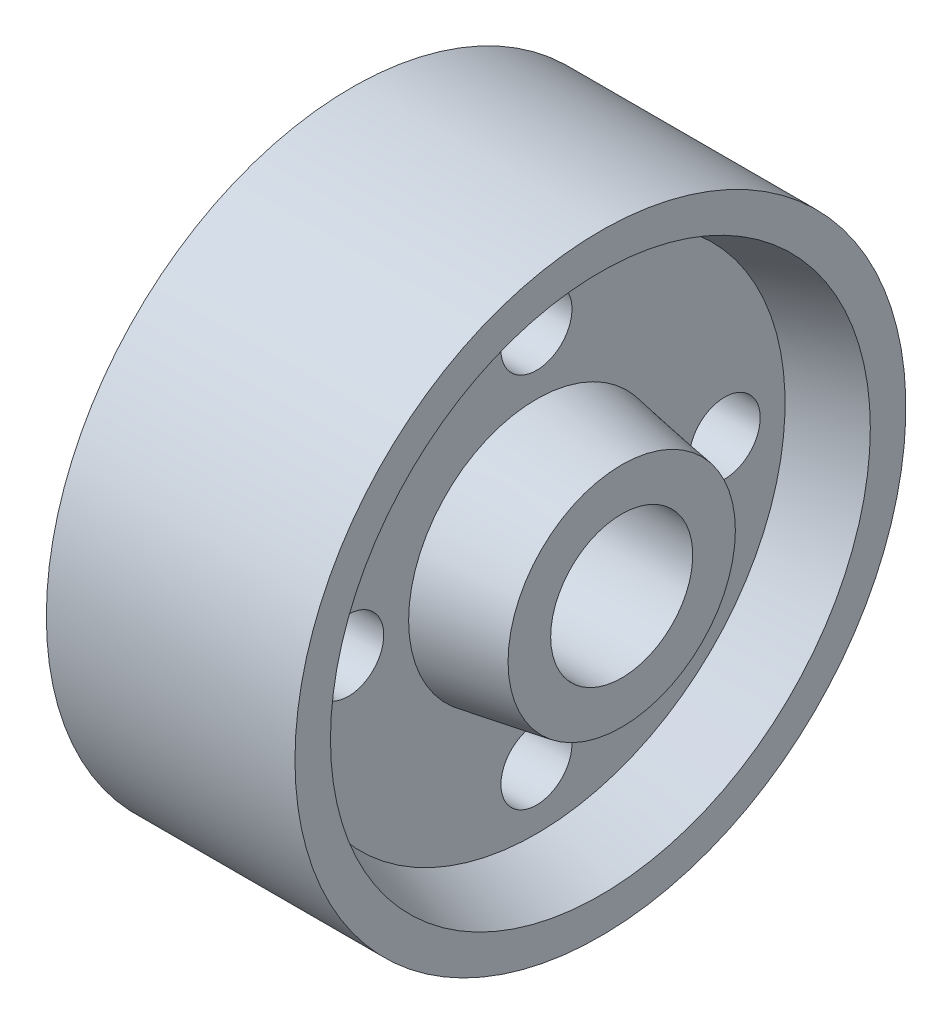
ISO-10303-21;
HEADER;
FILE_DESCRIPTION(('STEP AP214'),'2;1');
FILE_NAME('part.step','',(''),(''),'','','');
FILE_SCHEMA(('AUTOMOTIVE_DESIGN { 1 0 10303 214 1 1 1 1 }'));
ENDSEC;
DATA;
#1=APPLICATION_CONTEXT('core data for automotive mechanical design processes');
#2=APPLICATION_PROTOCOL_DEFINITION('international standard','automotive_design',2000,#1);
#3=PRODUCT_CONTEXT('',#1,'mechanical');
#4=PRODUCT('Part','Part','',(#3));
#5=PRODUCT_RELATED_PRODUCT_CATEGORY('part','',(#4));
#6=PRODUCT_DEFINITION_FORMATION('','',#4);
#7=PRODUCT_DEFINITION_CONTEXT('part definition',#1,'design');
#8=PRODUCT_DEFINITION('design','',#6,#7);
#9=PRODUCT_DEFINITION_SHAPE('','',#8);
#10=(LENGTH_UNIT() NAMED_UNIT(*) SI_UNIT(.MILLI.,.METRE.));
#11=(NAMED_UNIT(*) PLANE_ANGLE_UNIT() SI_UNIT($,.RADIAN.));
#12=(NAMED_UNIT(*) SI_UNIT($,.STERADIAN.) SOLID_ANGLE_UNIT());
#13=UNCERTAINTY_MEASURE_WITH_UNIT(LENGTH_MEASURE(1.E-05),#10,'distance_accuracy_value','');
#14=(GEOMETRIC_REPRESENTATION_CONTEXT(3) GLOBAL_UNCERTAINTY_ASSIGNED_CONTEXT((#13)) GLOBAL_UNIT_ASSIGNED_CONTEXT((#10,
#11,#12)) REPRESENTATION_CONTEXT('',''));
#15=CARTESIAN_POINT('',(0.,0.,0.));
#16=DIRECTION('',(0.,0.,1.));
#17=DIRECTION('',(1.,0.,0.));
#18=AXIS2_PLACEMENT_3D('',#15,#16,#17);
#19=CARTESIAN_POINT('',(41.,0.,0.));
#20=DIRECTION('',(-1.,0.,0.));
#21=DIRECTION('',(0.,0.,1.));
#22=AXIS2_PLACEMENT_3D('',#19,#20,#21);
#23=PLANE('',#22);
#24=CARTESIAN_POINT('',(41.,0.,0.));
#25=DIRECTION('',(-1.,0.,0.));
#26=DIRECTION('',(0.,0.,1.));
#27=AXIS2_PLACEMENT_3D('',#24,#25,#26);
#28=CIRCLE('',#27,10.);
#29=CARTESIAN_POINT('',(41.,0.,10.));
#30=VERTEX_POINT('',#29);
#31=EDGE_CURVE('E59',#30,#30,#28,.T.);
#32=ORIENTED_EDGE('',*,*,#31,.T.);
#33=EDGE_LOOP('',(#32));
#34=FACE_BOUND('',#33,.T.);
#35=CARTESIAN_POINT('',(41.,0.,0.));
#36=DIRECTION('',(-1.,0.,0.));
#37=DIRECTION('',(0.,0.,1.));
#38=AXIS2_PLACEMENT_3D('',#35,#36,#37);
#39=CIRCLE('',#38,16.);
#40=CARTESIAN_POINT('',(41.,0.,16.));
#41=VERTEX_POINT('',#40);
#42=EDGE_CURVE('E10',#41,#41,#39,.T.);
#43=ORIENTED_EDGE('',*,*,#42,.F.);
#44=EDGE_LOOP('',(#43));
#45=FACE_BOUND('',#44,.T.);
#46=ADVANCED_FACE('F39',(#34,#45),#23,.F.);
#47=CARTESIAN_POINT('',(41.,0.,0.));
#48=DIRECTION('',(-1.,0.,0.));
#49=DIRECTION('',(0.,0.,1.));
#50=AXIS2_PLACEMENT_3D('',#47,#48,#49);
#51=CONICAL_SURFACE('',#50,16.,0.165148677414626);
#52=CARTESIAN_POINT('',(29.,0.,0.));
#53=DIRECTION('',(-1.,0.,0.));
#54=DIRECTION('',(0.,0.,1.));
#55=AXIS2_PLACEMENT_3D('',#52,#53,#54);
#56=CIRCLE('',#55,18.);
#57=CARTESIAN_POINT('',(29.,0.,18.));
#58=VERTEX_POINT('',#57);
#59=EDGE_CURVE('E46',#58,#58,#56,.T.);
#60=ORIENTED_EDGE('',*,*,#59,.F.);
#61=EDGE_LOOP('',(#60));
#62=FACE_BOUND('',#61,.T.);
#63=ORIENTED_EDGE('',*,*,#42,.T.);
#64=EDGE_LOOP('',(#63));
#65=FACE_BOUND('',#64,.T.);
#66=ADVANCED_FACE('F108',(#62,#65),#51,.T.);
#67=CARTESIAN_POINT('',(29.,0.,-18.));
#68=DIRECTION('',(-1.,0.,0.));
#69=DIRECTION('',(0.,0.,1.));
#70=AXIS2_PLACEMENT_3D('',#67,#68,#69);
#71=PLANE('',#70);
#72=CARTESIAN_POINT('',(29.,26.5,0.));
#73=DIRECTION('',(-1.,0.,0.));
#74=DIRECTION('',(0.,0.,1.));
#75=AXIS2_PLACEMENT_3D('',#72,#73,#74);
#76=CIRCLE('',#75,5.);
#77=CARTESIAN_POINT('',(29.,26.5,5.));
#78=VERTEX_POINT('',#77);
#79=EDGE_CURVE('E77',#78,#78,#76,.T.);
#80=ORIENTED_EDGE('',*,*,#79,.T.);
#81=EDGE_LOOP('',(#80));
#82=FACE_BOUND('',#81,.T.);
#83=CARTESIAN_POINT('',(29.,0.,26.5));
#84=DIRECTION('',(-1.,0.,0.));
#85=DIRECTION('',(0.,0.,1.));
#86=AXIS2_PLACEMENT_3D('',#83,#84,#85);
#87=CIRCLE('',#86,4.99999999999999);
#88=CARTESIAN_POINT('',(29.,0.,31.5));
#89=VERTEX_POINT('',#88);
#90=EDGE_CURVE('E65',#89,#89,#87,.T.);
#91=ORIENTED_EDGE('',*,*,#90,.T.);
#92=EDGE_LOOP('',(#91));
#93=FACE_BOUND('',#92,.T.);
#94=CARTESIAN_POINT('',(29.,-26.5,0.));
#95=DIRECTION('',(-1.,0.,0.));
#96=DIRECTION('',(0.,0.,1.));
#97=AXIS2_PLACEMENT_3D('',#94,#95,#96);
#98=CIRCLE('',#97,5.);
#99=CARTESIAN_POINT('',(29.,-26.5,5.00000000000001));
#100=VERTEX_POINT('',#99);
#101=EDGE_CURVE('E62',#100,#100,#98,.T.);
#102=ORIENTED_EDGE('',*,*,#101,.T.);
#103=EDGE_LOOP('',(#102));
#104=FACE_BOUND('',#103,.T.);
#105=CARTESIAN_POINT('',(29.,0.,-26.5));
#106=DIRECTION('',(-1.,0.,0.));
#107=DIRECTION('',(0.,0.,1.));
#108=AXIS2_PLACEMENT_3D('',#105,#106,#107);
#109=CIRCLE('',#108,5.);
#110=CARTESIAN_POINT('',(29.,0.,-21.5));
#111=VERTEX_POINT('',#110);
#112=EDGE_CURVE('E58',#111,#111,#109,.T.);
#113=ORIENTED_EDGE('',*,*,#112,.T.);
#114=EDGE_LOOP('',(#113));
#115=FACE_BOUND('',#114,.T.);
#116=CARTESIAN_POINT('',(29.,0.,0.));
#117=DIRECTION('',(-1.,0.,0.));
#118=DIRECTION('',(0.,0.,1.));
#119=AXIS2_PLACEMENT_3D('',#116,#117,#118);
#120=CIRCLE('',#119,35.);
#121=CARTESIAN_POINT('',(29.,0.,35.));
#122=VERTEX_POINT('',#121);
#123=EDGE_CURVE('E51',#122,#122,#120,.T.);
#124=ORIENTED_EDGE('',*,*,#123,.F.);
#125=EDGE_LOOP('',(#124));
#126=FACE_BOUND('',#125,.T.);
#127=ORIENTED_EDGE('',*,*,#59,.T.);
#128=EDGE_LOOP('',(#127));
#129=FACE_BOUND('',#128,.T.);
#130=ADVANCED_FACE('F105',(#82,#93,#104,#115,#126,#129),#71,.F.);
#131=CARTESIAN_POINT('',(29.,0.,0.));
#132=DIRECTION('',(1.,0.,0.));
#133=DIRECTION('',(0.,0.,-1.));
#134=AXIS2_PLACEMENT_3D('',#131,#132,#133);
#135=CONICAL_SURFACE('',#134,35.,0.321750554396642);
#136=CARTESIAN_POINT('',(38.,0.,0.));
#137=DIRECTION('',(-1.,0.,0.));
#138=DIRECTION('',(0.,0.,1.));
#139=AXIS2_PLACEMENT_3D('',#136,#137,#138);
#140=CIRCLE('',#139,38.);
#141=CARTESIAN_POINT('',(38.,0.,38.));
#142=VERTEX_POINT('',#141);
#143=EDGE_CURVE('E98',#142,#142,#140,.T.);
#144=ORIENTED_EDGE('',*,*,#143,.F.);
#145=EDGE_LOOP('',(#144));
#146=FACE_BOUND('',#145,.T.);
#147=ORIENTED_EDGE('',*,*,#123,.T.);
#148=EDGE_LOOP('',(#147));
#149=FACE_BOUND('',#148,.T.);
#150=ADVANCED_FACE('F103',(#146,#149),#135,.F.);
#151=CARTESIAN_POINT('',(38.,0.,-38.));
#152=DIRECTION('',(-1.,0.,0.));
#153=DIRECTION('',(0.,0.,1.));
#154=AXIS2_PLACEMENT_3D('',#151,#152,#153);
#155=PLANE('',#154);
#156=CARTESIAN_POINT('',(38.,0.,0.));
#157=DIRECTION('',(-1.,0.,0.));
#158=DIRECTION('',(0.,0.,1.));
#159=AXIS2_PLACEMENT_3D('',#156,#157,#158);
#160=CIRCLE('',#159,43.);
#161=CARTESIAN_POINT('',(38.,0.,43.));
#162=VERTEX_POINT('',#161);
#163=EDGE_CURVE('E95',#162,#162,#160,.T.);
#164=ORIENTED_EDGE('',*,*,#163,.F.);
#165=EDGE_LOOP('',(#164));
#166=FACE_BOUND('',#165,.T.);
#167=ORIENTED_EDGE('',*,*,#143,.T.);
#168=EDGE_LOOP('',(#167));
#169=FACE_BOUND('',#168,.T.);
#170=ADVANCED_FACE('F120',(#166,#169),#155,.F.);
#171=CARTESIAN_POINT('',(0.,0.,0.));
#172=DIRECTION('',(-1.,0.,0.));
#173=DIRECTION('',(0.,0.,1.));
#174=AXIS2_PLACEMENT_3D('',#171,#172,#173);
#175=CYLINDRICAL_SURFACE('',#174,43.);
#176=CARTESIAN_POINT('',(2.99999999999999,0.,0.));
#177=DIRECTION('',(-1.,0.,0.));
#178=DIRECTION('',(0.,0.,1.));
#179=AXIS2_PLACEMENT_3D('',#176,#177,#178);
#180=CIRCLE('',#179,43.);
#181=CARTESIAN_POINT('',(2.99999999999999,0.,43.));
#182=VERTEX_POINT('',#181);
#183=EDGE_CURVE('E92',#182,#182,#180,.T.);
#184=ORIENTED_EDGE('',*,*,#183,.F.);
#185=EDGE_LOOP('',(#184));
#186=FACE_BOUND('',#185,.T.);
#187=ORIENTED_EDGE('',*,*,#163,.T.);
#188=EDGE_LOOP('',(#187));
#189=FACE_BOUND('',#188,.T.);
#190=ADVANCED_FACE('F124',(#186,#189),#175,.T.);
#191=CARTESIAN_POINT('',(2.99999999999999,0.,-38.));
#192=DIRECTION('',(1.,0.,0.));
#193=DIRECTION('',(0.,0.,-1.));
#194=AXIS2_PLACEMENT_3D('',#191,#192,#193);
#195=PLANE('',#194);
#196=CARTESIAN_POINT('',(2.99999999999999,0.,0.));
#197=DIRECTION('',(-1.,0.,0.));
#198=DIRECTION('',(0.,0.,1.));
#199=AXIS2_PLACEMENT_3D('',#196,#197,#198);
#200=CIRCLE('',#199,38.);
#201=CARTESIAN_POINT('',(2.99999999999999,0.,38.));
#202=VERTEX_POINT('',#201);
#203=EDGE_CURVE('E89',#202,#202,#200,.T.);
#204=ORIENTED_EDGE('',*,*,#203,.F.);
#205=EDGE_LOOP('',(#204));
#206=FACE_BOUND('',#205,.T.);
#207=ORIENTED_EDGE('',*,*,#183,.T.);
#208=EDGE_LOOP('',(#207));
#209=FACE_BOUND('',#208,.T.);
#210=ADVANCED_FACE('F128',(#206,#209),#195,.F.);
#211=CARTESIAN_POINT('',(2.99999999999999,0.,0.));
#212=DIRECTION('',(-1.,0.,0.));
#213=DIRECTION('',(0.,0.,1.));
#214=AXIS2_PLACEMENT_3D('',#211,#212,#213);
#215=CONICAL_SURFACE('',#214,38.,0.321750554396642);
#216=CARTESIAN_POINT('',(12.,0.,0.));
#217=DIRECTION('',(-1.,0.,0.));
#218=DIRECTION('',(0.,0.,1.));
#219=AXIS2_PLACEMENT_3D('',#216,#217,#218);
#220=CIRCLE('',#219,35.);
#221=CARTESIAN_POINT('',(12.,0.,35.));
#222=VERTEX_POINT('',#221);
#223=EDGE_CURVE('E86',#222,#222,#220,.T.);
#224=ORIENTED_EDGE('',*,*,#223,.F.);
#225=EDGE_LOOP('',(#224));
#226=FACE_BOUND('',#225,.T.);
#227=ORIENTED_EDGE('',*,*,#203,.T.);
#228=EDGE_LOOP('',(#227));
#229=FACE_BOUND('',#228,.T.);
#230=ADVANCED_FACE('F132',(#226,#229),#215,.F.);
#231=CARTESIAN_POINT('',(12.,0.,-18.));
#232=DIRECTION('',(1.,0.,0.));
#233=DIRECTION('',(0.,0.,-1.));
#234=AXIS2_PLACEMENT_3D('',#231,#232,#233);
#235=PLANE('',#234);
#236=CARTESIAN_POINT('',(12.,26.5,0.));
#237=DIRECTION('',(1.,0.,0.));
#238=DIRECTION('',(0.,0.,-1.));
#239=AXIS2_PLACEMENT_3D('',#236,#237,#238);
#240=CIRCLE('',#239,5.);
#241=CARTESIAN_POINT('',(12.,26.5,-5.));
#242=VERTEX_POINT('',#241);
#243=EDGE_CURVE('E42',#242,#242,#240,.T.);
#244=ORIENTED_EDGE('',*,*,#243,.T.);
#245=EDGE_LOOP('',(#244));
#246=FACE_BOUND('',#245,.T.);
#247=CARTESIAN_POINT('',(12.,0.,26.5));
#248=DIRECTION('',(1.,0.,0.));
#249=DIRECTION('',(0.,0.,-1.));
#250=AXIS2_PLACEMENT_3D('',#247,#248,#249);
#251=CIRCLE('',#250,4.99999999999999);
#252=CARTESIAN_POINT('',(12.,0.,21.5));
#253=VERTEX_POINT('',#252);
#254=EDGE_CURVE('E63',#253,#253,#251,.T.);
#255=ORIENTED_EDGE('',*,*,#254,.T.);
#256=EDGE_LOOP('',(#255));
#257=FACE_BOUND('',#256,.T.);
#258=CARTESIAN_POINT('',(12.,-26.5,0.));
#259=DIRECTION('',(1.,0.,0.));
#260=DIRECTION('',(0.,0.,-1.));
#261=AXIS2_PLACEMENT_3D('',#258,#259,#260);
#262=CIRCLE('',#261,5.);
#263=CARTESIAN_POINT('',(12.,-26.5,-5.));
#264=VERTEX_POINT('',#263);
#265=EDGE_CURVE('E60',#264,#264,#262,.T.);
#266=ORIENTED_EDGE('',*,*,#265,.T.);
#267=EDGE_LOOP('',(#266));
#268=FACE_BOUND('',#267,.T.);
#269=CARTESIAN_POINT('',(12.,0.,-26.5));
#270=DIRECTION('',(1.,0.,0.));
#271=DIRECTION('',(0.,0.,-1.));
#272=AXIS2_PLACEMENT_3D('',#269,#270,#271);
#273=CIRCLE('',#272,5.);
#274=CARTESIAN_POINT('',(12.,0.,-31.5));
#275=VERTEX_POINT('',#274);
#276=EDGE_CURVE('E55',#275,#275,#273,.T.);
#277=ORIENTED_EDGE('',*,*,#276,.T.);
#278=EDGE_LOOP('',(#277));
#279=FACE_BOUND('',#278,.T.);
#280=CARTESIAN_POINT('',(12.,0.,0.));
#281=DIRECTION('',(-1.,0.,0.));
#282=DIRECTION('',(0.,0.,1.));
#283=AXIS2_PLACEMENT_3D('',#280,#281,#282);
#284=CIRCLE('',#283,18.);
#285=CARTESIAN_POINT('',(12.,0.,18.));
#286=VERTEX_POINT('',#285);
#287=EDGE_CURVE('E83',#286,#286,#284,.T.);
#288=ORIENTED_EDGE('',*,*,#287,.F.);
#289=EDGE_LOOP('',(#288));
#290=FACE_BOUND('',#289,.T.);
#291=ORIENTED_EDGE('',*,*,#223,.T.);
#292=EDGE_LOOP('',(#291));
#293=FACE_BOUND('',#292,.T.);
#294=ADVANCED_FACE('F136',(#246,#257,#268,#279,#290,#293),#235,.F.);
#295=CARTESIAN_POINT('',(12.,0.,0.));
#296=DIRECTION('',(1.,0.,0.));
#297=DIRECTION('',(0.,0.,-1.));
#298=AXIS2_PLACEMENT_3D('',#295,#296,#297);
#299=CONICAL_SURFACE('',#298,18.,0.165148677414627);
#300=CARTESIAN_POINT('',(0.,0.,0.));
#301=DIRECTION('',(-1.,0.,0.));
#302=DIRECTION('',(0.,0.,1.));
#303=AXIS2_PLACEMENT_3D('',#300,#301,#302);
#304=CIRCLE('',#303,16.);
#305=CARTESIAN_POINT('',(0.,0.,16.));
#306=VERTEX_POINT('',#305);
#307=EDGE_CURVE('E80',#306,#306,#304,.T.);
#308=ORIENTED_EDGE('',*,*,#307,.F.);
#309=EDGE_LOOP('',(#308));
#310=FACE_BOUND('',#309,.T.);
#311=ORIENTED_EDGE('',*,*,#287,.T.);
#312=EDGE_LOOP('',(#311));
#313=FACE_BOUND('',#312,.T.);
#314=ADVANCED_FACE('F140',(#310,#313),#299,.T.);
#315=CARTESIAN_POINT('',(0.,0.,0.));
#316=DIRECTION('',(1.,0.,0.));
#317=DIRECTION('',(0.,0.,-1.));
#318=AXIS2_PLACEMENT_3D('',#315,#316,#317);
#319=PLANE('',#318);
#320=CARTESIAN_POINT('',(0.,0.,0.));
#321=DIRECTION('',(-1.,0.,0.));
#322=DIRECTION('',(0.,0.,1.));
#323=AXIS2_PLACEMENT_3D('',#320,#321,#322);
#324=CIRCLE('',#323,10.);
#325=CARTESIAN_POINT('',(0.,0.,10.));
#326=VERTEX_POINT('',#325);
#327=EDGE_CURVE('E176',#326,#326,#324,.T.);
#328=ORIENTED_EDGE('',*,*,#327,.F.);
#329=EDGE_LOOP('',(#328));
#330=FACE_BOUND('',#329,.T.);
#331=ORIENTED_EDGE('',*,*,#307,.T.);
#332=EDGE_LOOP('',(#331));
#333=FACE_BOUND('',#332,.T.);
#334=ADVANCED_FACE('F144',(#330,#333),#319,.F.);
#335=CARTESIAN_POINT('',(41.,0.,-26.5));
#336=DIRECTION('',(-1.,0.,0.));
#337=DIRECTION('',(0.,0.,1.));
#338=AXIS2_PLACEMENT_3D('',#335,#336,#337);
#339=CYLINDRICAL_SURFACE('',#338,5.);
#340=ORIENTED_EDGE('',*,*,#276,.F.);
#341=EDGE_LOOP('',(#340));
#342=FACE_BOUND('',#341,.T.);
#343=ORIENTED_EDGE('',*,*,#112,.F.);
#344=EDGE_LOOP('',(#343));
#345=FACE_BOUND('',#344,.T.);
#346=ADVANCED_FACE('F148',(#342,#345),#339,.F.);
#347=CARTESIAN_POINT('',(41.,-26.5,0.));
#348=DIRECTION('',(-1.,0.,0.));
#349=DIRECTION('',(0.,0.,1.));
#350=AXIS2_PLACEMENT_3D('',#347,#348,#349);
#351=CYLINDRICAL_SURFACE('',#350,5.);
#352=ORIENTED_EDGE('',*,*,#265,.F.);
#353=EDGE_LOOP('',(#352));
#354=FACE_BOUND('',#353,.T.);
#355=ORIENTED_EDGE('',*,*,#101,.F.);
#356=EDGE_LOOP('',(#355));
#357=FACE_BOUND('',#356,.T.);
#358=ADVANCED_FACE('F152',(#354,#357),#351,.F.);
#359=CARTESIAN_POINT('',(41.,0.,26.5));
#360=DIRECTION('',(-1.,0.,0.));
#361=DIRECTION('',(0.,0.,1.));
#362=AXIS2_PLACEMENT_3D('',#359,#360,#361);
#363=CYLINDRICAL_SURFACE('',#362,4.99999999999999);
#364=ORIENTED_EDGE('',*,*,#254,.F.);
#365=EDGE_LOOP('',(#364));
#366=FACE_BOUND('',#365,.T.);
#367=ORIENTED_EDGE('',*,*,#90,.F.);
#368=EDGE_LOOP('',(#367));
#369=FACE_BOUND('',#368,.T.);
#370=ADVANCED_FACE('F156',(#366,#369),#363,.F.);
#371=CARTESIAN_POINT('',(41.,26.5,0.));
#372=DIRECTION('',(-1.,0.,0.));
#373=DIRECTION('',(0.,0.,1.));
#374=AXIS2_PLACEMENT_3D('',#371,#372,#373);
#375=CYLINDRICAL_SURFACE('',#374,5.);
#376=ORIENTED_EDGE('',*,*,#243,.F.);
#377=EDGE_LOOP('',(#376));
#378=FACE_BOUND('',#377,.T.);
#379=ORIENTED_EDGE('',*,*,#79,.F.);
#380=EDGE_LOOP('',(#379));
#381=FACE_BOUND('',#380,.T.);
#382=ADVANCED_FACE('F160',(#378,#381),#375,.F.);
#383=CARTESIAN_POINT('',(41.,0.,0.));
#384=DIRECTION('',(-1.,0.,0.));
#385=DIRECTION('',(0.,0.,1.));
#386=AXIS2_PLACEMENT_3D('',#383,#384,#385);
#387=CYLINDRICAL_SURFACE('',#386,10.);
#388=ORIENTED_EDGE('',*,*,#31,.F.);
#389=EDGE_LOOP('',(#388));
#390=FACE_BOUND('',#389,.T.);
#391=ORIENTED_EDGE('',*,*,#327,.T.);
#392=EDGE_LOOP('',(#391));
#393=FACE_BOUND('',#392,.T.);
#394=ADVANCED_FACE('F164',(#390,#393),#387,.F.);
#395=CLOSED_SHELL('',(#46,#66,#130,#150,#170,#190,#210,#230,#294,#314,#334,#346,#358,#370,#382,#394));
#396=MANIFOLD_SOLID_BREP('B2',#395);
#397=ADVANCED_BREP_SHAPE_REPRESENTATION('',(#18,#396),#14);
#398=SHAPE_DEFINITION_REPRESENTATION(#9,#397);
ENDSEC;
END-ISO-10303-21;
